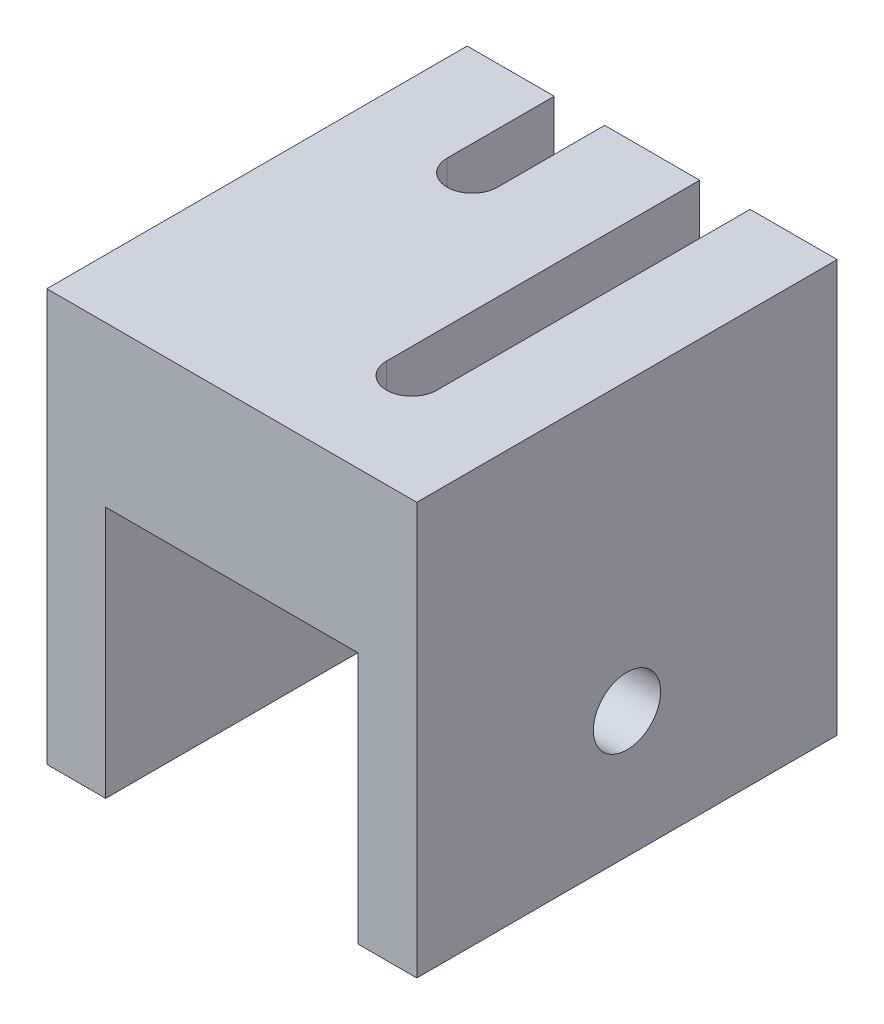
ISO-10303-21;
HEADER;
FILE_DESCRIPTION(('STEP AP214'),'2;1');
FILE_NAME('part.step','',(''),(''),'','','');
FILE_SCHEMA(('AUTOMOTIVE_DESIGN { 1 0 10303 214 1 1 1 1 }'));
ENDSEC;
DATA;
#1=APPLICATION_CONTEXT('core data for automotive mechanical design processes');
#2=APPLICATION_PROTOCOL_DEFINITION('international standard','automotive_design',2000,#1);
#3=PRODUCT_CONTEXT('',#1,'mechanical');
#4=PRODUCT('Part','Part','',(#3));
#5=PRODUCT_RELATED_PRODUCT_CATEGORY('part','',(#4));
#6=PRODUCT_DEFINITION_FORMATION('','',#4);
#7=PRODUCT_DEFINITION_CONTEXT('part definition',#1,'design');
#8=PRODUCT_DEFINITION('design','',#6,#7);
#9=PRODUCT_DEFINITION_SHAPE('','',#8);
#10=(LENGTH_UNIT() NAMED_UNIT(*) SI_UNIT(.MILLI.,.METRE.));
#11=(NAMED_UNIT(*) PLANE_ANGLE_UNIT() SI_UNIT($,.RADIAN.));
#12=(NAMED_UNIT(*) SI_UNIT($,.STERADIAN.) SOLID_ANGLE_UNIT());
#13=UNCERTAINTY_MEASURE_WITH_UNIT(LENGTH_MEASURE(1.E-05),#10,'distance_accuracy_value','');
#14=(GEOMETRIC_REPRESENTATION_CONTEXT(3) GLOBAL_UNCERTAINTY_ASSIGNED_CONTEXT((#13)) GLOBAL_UNIT_ASSIGNED_CONTEXT((#10,
#11,#12)) REPRESENTATION_CONTEXT('',''));
#15=CARTESIAN_POINT('',(0.,0.,0.));
#16=DIRECTION('',(0.,0.,1.));
#17=DIRECTION('',(1.,0.,0.));
#18=AXIS2_PLACEMENT_3D('',#15,#16,#17);
#19=CARTESIAN_POINT('',(0.,22.,50.));
#20=DIRECTION('',(0.,1.,0.));
#21=DIRECTION('',(0.,0.,1.));
#22=AXIS2_PLACEMENT_3D('',#19,#20,#21);
#23=PLANE('',#22);
#24=CARTESIAN_POINT('',(8.65024796436644,22.,37.2545179486985));
#25=DIRECTION('',(0.,1.,0.));
#26=DIRECTION('',(0.,0.,1.));
#27=AXIS2_PLACEMENT_3D('',#24,#25,#26);
#28=CIRCLE('',#27,5.);
#29=CARTESIAN_POINT('',(3.65024796436644,22.,37.2545179486985));
#30=VERTEX_POINT('',#29);
#31=CARTESIAN_POINT('',(13.6502479643664,22.,37.2545179486985));
#32=VERTEX_POINT('',#31);
#33=EDGE_CURVE('E210',#30,#32,#28,.T.);
#34=ORIENTED_EDGE('',*,*,#33,.T.);
#35=DIRECTION('',(0.,0.,-1.));
#36=VECTOR('',#35,1.);
#37=CARTESIAN_POINT('',(13.6502479643664,22.,0.));
#38=LINE('',#37,#36);
#39=CARTESIAN_POINT('',(13.6502479643664,22.,0.));
#40=VERTEX_POINT('',#39);
#41=EDGE_CURVE('E295',#32,#40,#38,.T.);
#42=ORIENTED_EDGE('',*,*,#41,.T.);
#43=DIRECTION('',(1.,0.,0.));
#44=VECTOR('',#43,1.);
#45=CARTESIAN_POINT('',(0.,22.,0.));
#46=LINE('',#45,#44);
#47=CARTESIAN_POINT('',(3.65024796436644,22.,0.));
#48=VERTEX_POINT('',#47);
#49=EDGE_CURVE('E362',#48,#40,#46,.T.);
#50=ORIENTED_EDGE('',*,*,#49,.F.);
#51=DIRECTION('',(0.,0.,-1.));
#52=VECTOR('',#51,1.);
#53=CARTESIAN_POINT('',(3.65024796436644,22.,0.));
#54=LINE('',#53,#52);
#55=EDGE_CURVE('E310',#30,#48,#54,.T.);
#56=ORIENTED_EDGE('',*,*,#55,.F.);
#57=EDGE_LOOP('',(#34,#42,#50,#56));
#58=FACE_BOUND('',#57,.T.);
#59=ADVANCED_FACE('F37',(#58),#23,.T.);
#60=CARTESIAN_POINT('',(0.,-15.,50.));
#61=DIRECTION('',(0.,1.,0.));
#62=DIRECTION('',(0.,0.,1.));
#63=AXIS2_PLACEMENT_3D('',#60,#61,#62);
#64=PLANE('',#63);
#65=DIRECTION('',(1.,0.,0.));
#66=VECTOR('',#65,1.);
#67=CARTESIAN_POINT('',(0.,-15.,0.));
#68=LINE('',#67,#66);
#69=CARTESIAN_POINT('',(15.,-15.,0.));
#70=VERTEX_POINT('',#69);
#71=CARTESIAN_POINT('',(22.,-15.,0.));
#72=VERTEX_POINT('',#71);
#73=EDGE_CURVE('E358',#70,#72,#68,.T.);
#74=ORIENTED_EDGE('',*,*,#73,.T.);
#75=DIRECTION('',(0.,0.,-1.));
#76=VECTOR('',#75,1.);
#77=CARTESIAN_POINT('',(22.,-15.,50.));
#78=LINE('',#77,#76);
#79=CARTESIAN_POINT('',(22.,-15.,50.));
#80=VERTEX_POINT('',#79);
#81=EDGE_CURVE('E366',#80,#72,#78,.T.);
#82=ORIENTED_EDGE('',*,*,#81,.F.);
#83=DIRECTION('',(1.,0.,0.));
#84=VECTOR('',#83,1.);
#85=CARTESIAN_POINT('',(0.,-15.,50.));
#86=LINE('',#85,#84);
#87=CARTESIAN_POINT('',(15.,-15.,50.));
#88=VERTEX_POINT('',#87);
#89=EDGE_CURVE('E346',#88,#80,#86,.T.);
#90=ORIENTED_EDGE('',*,*,#89,.F.);
#91=DIRECTION('',(0.,0.,-1.));
#92=VECTOR('',#91,1.);
#93=CARTESIAN_POINT('',(15.,-15.,50.));
#94=LINE('',#93,#92);
#95=EDGE_CURVE('E46',#88,#70,#94,.T.);
#96=ORIENTED_EDGE('',*,*,#95,.T.);
#97=EDGE_LOOP('',(#74,#82,#90,#96));
#98=FACE_BOUND('',#97,.T.);
#99=ADVANCED_FACE('F437',(#98),#64,.F.);
#100=CARTESIAN_POINT('',(22.,0.,50.));
#101=DIRECTION('',(-1.,0.,0.));
#102=DIRECTION('',(0.,0.,1.));
#103=AXIS2_PLACEMENT_3D('',#100,#101,#102);
#104=PLANE('',#103);
#105=CARTESIAN_POINT('',(22.,0.,25.));
#106=DIRECTION('',(-1.,0.,0.));
#107=DIRECTION('',(0.,0.,1.));
#108=AXIS2_PLACEMENT_3D('',#105,#106,#107);
#109=CIRCLE('',#108,4.);
#110=CARTESIAN_POINT('',(22.,0.,29.));
#111=VERTEX_POINT('',#110);
#112=EDGE_CURVE('E777',#111,#111,#109,.T.);
#113=ORIENTED_EDGE('',*,*,#112,.T.);
#114=EDGE_LOOP('',(#113));
#115=FACE_BOUND('',#114,.T.);
#116=DIRECTION('',(0.,1.,0.));
#117=VECTOR('',#116,1.);
#118=CARTESIAN_POINT('',(22.,0.,0.));
#119=LINE('',#118,#117);
#120=CARTESIAN_POINT('',(22.,34.,0.));
#121=VERTEX_POINT('',#120);
#122=EDGE_CURVE('E360',#72,#121,#119,.T.);
#123=ORIENTED_EDGE('',*,*,#122,.T.);
#124=DIRECTION('',(0.,0.,-1.));
#125=VECTOR('',#124,1.);
#126=CARTESIAN_POINT('',(22.,34.,0.));
#127=LINE('',#126,#125);
#128=CARTESIAN_POINT('',(22.,34.,50.));
#129=VERTEX_POINT('',#128);
#130=EDGE_CURVE('E242',#129,#121,#127,.T.);
#131=ORIENTED_EDGE('',*,*,#130,.F.);
#132=DIRECTION('',(0.,1.,0.));
#133=VECTOR('',#132,1.);
#134=CARTESIAN_POINT('',(22.,0.,50.));
#135=LINE('',#134,#133);
#136=EDGE_CURVE('E348',#80,#129,#135,.T.);
#137=ORIENTED_EDGE('',*,*,#136,.F.);
#138=ORIENTED_EDGE('',*,*,#81,.T.);
#139=EDGE_LOOP('',(#123,#131,#137,#138));
#140=FACE_BOUND('',#139,.T.);
#141=ADVANCED_FACE('F444',(#115,#140),#104,.F.);
#142=CARTESIAN_POINT('',(0.,0.,50.));
#143=DIRECTION('',(0.,0.,1.));
#144=DIRECTION('',(1.,0.,0.));
#145=AXIS2_PLACEMENT_3D('',#142,#143,#144);
#146=PLANE('',#145);
#147=DIRECTION('',(1.,0.,0.));
#148=VECTOR('',#147,1.);
#149=CARTESIAN_POINT('',(0.,15.,50.));
#150=LINE('',#149,#148);
#151=CARTESIAN_POINT('',(-15.,15.,50.));
#152=VERTEX_POINT('',#151);
#153=CARTESIAN_POINT('',(15.,15.,50.));
#154=VERTEX_POINT('',#153);
#155=EDGE_CURVE('E340',#152,#154,#150,.T.);
#156=ORIENTED_EDGE('',*,*,#155,.T.);
#157=DIRECTION('',(0.,1.,0.));
#158=VECTOR('',#157,1.);
#159=CARTESIAN_POINT('',(15.,0.,50.));
#160=LINE('',#159,#158);
#161=EDGE_CURVE('E342',#88,#154,#160,.T.);
#162=ORIENTED_EDGE('',*,*,#161,.F.);
#163=ORIENTED_EDGE('',*,*,#89,.T.);
#164=ORIENTED_EDGE('',*,*,#136,.T.);
#165=DIRECTION('',(1.,0.,0.));
#166=VECTOR('',#165,1.);
#167=CARTESIAN_POINT('',(0.,34.,50.));
#168=LINE('',#167,#166);
#169=CARTESIAN_POINT('',(-22.,34.,50.));
#170=VERTEX_POINT('',#169);
#171=EDGE_CURVE('E239',#170,#129,#168,.T.);
#172=ORIENTED_EDGE('',*,*,#171,.F.);
#173=DIRECTION('',(0.,1.,0.));
#174=VECTOR('',#173,1.);
#175=CARTESIAN_POINT('',(-22.,-15.,50.));
#176=LINE('',#175,#174);
#177=CARTESIAN_POINT('',(-22.,-15.,50.));
#178=VERTEX_POINT('',#177);
#179=EDGE_CURVE('E370',#178,#170,#176,.T.);
#180=ORIENTED_EDGE('',*,*,#179,.F.);
#181=DIRECTION('',(-1.,0.,0.));
#182=VECTOR('',#181,1.);
#183=CARTESIAN_POINT('',(-15.,-15.,50.));
#184=LINE('',#183,#182);
#185=CARTESIAN_POINT('',(-15.,-15.,50.));
#186=VERTEX_POINT('',#185);
#187=EDGE_CURVE('E372',#186,#178,#184,.T.);
#188=ORIENTED_EDGE('',*,*,#187,.F.);
#189=DIRECTION('',(0.,1.,0.));
#190=VECTOR('',#189,1.);
#191=CARTESIAN_POINT('',(-15.,-15.,50.));
#192=LINE('',#191,#190);
#193=EDGE_CURVE('E376',#186,#152,#192,.T.);
#194=ORIENTED_EDGE('',*,*,#193,.T.);
#195=EDGE_LOOP('',(#156,#162,#163,#164,#172,#180,#188,#194));
#196=FACE_BOUND('',#195,.T.);
#197=ADVANCED_FACE('F401',(#196),#146,.T.);
#198=CARTESIAN_POINT('',(15.,0.,50.));
#199=DIRECTION('',(-1.,0.,0.));
#200=DIRECTION('',(0.,0.,1.));
#201=AXIS2_PLACEMENT_3D('',#198,#199,#200);
#202=PLANE('',#201);
#203=CARTESIAN_POINT('',(15.,0.,25.));
#204=DIRECTION('',(-1.,0.,0.));
#205=DIRECTION('',(0.,0.,1.));
#206=AXIS2_PLACEMENT_3D('',#203,#204,#205);
#207=CIRCLE('',#206,4.);
#208=CARTESIAN_POINT('',(15.,0.,29.));
#209=VERTEX_POINT('',#208);
#210=EDGE_CURVE('E758',#209,#209,#207,.T.);
#211=ORIENTED_EDGE('',*,*,#210,.F.);
#212=EDGE_LOOP('',(#211));
#213=FACE_BOUND('',#212,.T.);
#214=DIRECTION('',(0.,1.,0.));
#215=VECTOR('',#214,1.);
#216=CARTESIAN_POINT('',(15.,0.,0.));
#217=LINE('',#216,#215);
#218=CARTESIAN_POINT('',(15.,15.,0.));
#219=VERTEX_POINT('',#218);
#220=EDGE_CURVE('E354',#70,#219,#217,.T.);
#221=ORIENTED_EDGE('',*,*,#220,.F.);
#222=ORIENTED_EDGE('',*,*,#95,.F.);
#223=ORIENTED_EDGE('',*,*,#161,.T.);
#224=DIRECTION('',(0.,0.,-1.));
#225=VECTOR('',#224,1.);
#226=CARTESIAN_POINT('',(15.,15.,50.));
#227=LINE('',#226,#225);
#228=EDGE_CURVE('E11',#154,#219,#227,.T.);
#229=ORIENTED_EDGE('',*,*,#228,.T.);
#230=EDGE_LOOP('',(#221,#222,#223,#229));
#231=FACE_BOUND('',#230,.T.);
#232=ADVANCED_FACE('F461',(#213,#231),#202,.T.);
#233=CARTESIAN_POINT('',(0.,0.,0.));
#234=DIRECTION('',(0.,0.,1.));
#235=DIRECTION('',(1.,0.,0.));
#236=AXIS2_PLACEMENT_3D('',#233,#234,#235);
#237=PLANE('',#236);
#238=DIRECTION('',(1.,0.,0.));
#239=VECTOR('',#238,1.);
#240=CARTESIAN_POINT('',(0.,15.,0.));
#241=LINE('',#240,#239);
#242=CARTESIAN_POINT('',(-15.,15.,0.));
#243=VERTEX_POINT('',#242);
#244=EDGE_CURVE('E351',#243,#219,#241,.T.);
#245=ORIENTED_EDGE('',*,*,#244,.F.);
#246=DIRECTION('',(0.,1.,0.));
#247=VECTOR('',#246,1.);
#248=CARTESIAN_POINT('',(-15.,-15.,0.));
#249=LINE('',#248,#247);
#250=CARTESIAN_POINT('',(-15.,-15.,0.));
#251=VERTEX_POINT('',#250);
#252=EDGE_CURVE('E373',#251,#243,#249,.T.);
#253=ORIENTED_EDGE('',*,*,#252,.F.);
#254=DIRECTION('',(-1.,0.,0.));
#255=VECTOR('',#254,1.);
#256=CARTESIAN_POINT('',(-15.,-15.,0.));
#257=LINE('',#256,#255);
#258=CARTESIAN_POINT('',(-22.,-15.,0.));
#259=VERTEX_POINT('',#258);
#260=EDGE_CURVE('E381',#251,#259,#257,.T.);
#261=ORIENTED_EDGE('',*,*,#260,.T.);
#262=DIRECTION('',(0.,1.,0.));
#263=VECTOR('',#262,1.);
#264=CARTESIAN_POINT('',(-22.,-15.,0.));
#265=LINE('',#264,#263);
#266=CARTESIAN_POINT('',(-22.,34.,0.));
#267=VERTEX_POINT('',#266);
#268=EDGE_CURVE('E339',#259,#267,#265,.T.);
#269=ORIENTED_EDGE('',*,*,#268,.T.);
#270=DIRECTION('',(-1.,0.,0.));
#271=VECTOR('',#270,1.);
#272=CARTESIAN_POINT('',(0.,34.,0.));
#273=LINE('',#272,#271);
#274=CARTESIAN_POINT('',(-11.6502479643664,34.,0.));
#275=VERTEX_POINT('',#274);
#276=EDGE_CURVE('E233',#275,#267,#273,.T.);
#277=ORIENTED_EDGE('',*,*,#276,.F.);
#278=DIRECTION('',(0.,-1.,0.));
#279=VECTOR('',#278,1.);
#280=CARTESIAN_POINT('',(-11.6502479643664,34.,0.));
#281=LINE('',#280,#279);
#282=CARTESIAN_POINT('',(-11.6502479643664,28.,0.));
#283=VERTEX_POINT('',#282);
#284=EDGE_CURVE('E285',#275,#283,#281,.T.);
#285=ORIENTED_EDGE('',*,*,#284,.T.);
#286=DIRECTION('',(-1.,0.,0.));
#287=VECTOR('',#286,1.);
#288=CARTESIAN_POINT('',(0.,28.,0.));
#289=LINE('',#288,#287);
#290=CARTESIAN_POINT('',(-13.6502479643664,28.,0.));
#291=VERTEX_POINT('',#290);
#292=EDGE_CURVE('E264',#283,#291,#289,.T.);
#293=ORIENTED_EDGE('',*,*,#292,.T.);
#294=DIRECTION('',(0.,-1.,0.));
#295=VECTOR('',#294,1.);
#296=CARTESIAN_POINT('',(-13.6502479643664,28.,0.));
#297=LINE('',#296,#295);
#298=CARTESIAN_POINT('',(-13.6502479643664,22.,0.));
#299=VERTEX_POINT('',#298);
#300=EDGE_CURVE('E323',#291,#299,#297,.T.);
#301=ORIENTED_EDGE('',*,*,#300,.T.);
#302=CARTESIAN_POINT('',(-3.65024796436643,22.,0.));
#303=VERTEX_POINT('',#302);
#304=EDGE_CURVE('E343',#299,#303,#46,.T.);
#305=ORIENTED_EDGE('',*,*,#304,.T.);
#306=DIRECTION('',(0.,-1.,0.));
#307=VECTOR('',#306,1.);
#308=CARTESIAN_POINT('',(-3.65024796436643,28.,0.));
#309=LINE('',#308,#307);
#310=CARTESIAN_POINT('',(-3.65024796436643,28.,0.));
#311=VERTEX_POINT('',#310);
#312=EDGE_CURVE('E330',#311,#303,#309,.T.);
#313=ORIENTED_EDGE('',*,*,#312,.F.);
#314=DIRECTION('',(1.,0.,0.));
#315=VECTOR('',#314,1.);
#316=CARTESIAN_POINT('',(0.,28.,0.));
#317=LINE('',#316,#315);
#318=CARTESIAN_POINT('',(-5.65024796436643,28.,0.));
#319=VERTEX_POINT('',#318);
#320=EDGE_CURVE('E205',#319,#311,#317,.T.);
#321=ORIENTED_EDGE('',*,*,#320,.F.);
#322=DIRECTION('',(0.,-1.,0.));
#323=VECTOR('',#322,1.);
#324=CARTESIAN_POINT('',(-5.65024796436643,34.,0.));
#325=LINE('',#324,#323);
#326=CARTESIAN_POINT('',(-5.65024796436643,34.,0.));
#327=VERTEX_POINT('',#326);
#328=EDGE_CURVE('E198',#327,#319,#325,.T.);
#329=ORIENTED_EDGE('',*,*,#328,.F.);
#330=DIRECTION('',(1.,0.,0.));
#331=VECTOR('',#330,1.);
#332=CARTESIAN_POINT('',(0.,34.,0.));
#333=LINE('',#332,#331);
#334=CARTESIAN_POINT('',(5.65024796436644,34.,0.));
#335=VERTEX_POINT('',#334);
#336=EDGE_CURVE('E203',#327,#335,#333,.T.);
#337=ORIENTED_EDGE('',*,*,#336,.T.);
#338=DIRECTION('',(0.,-1.,0.));
#339=VECTOR('',#338,1.);
#340=CARTESIAN_POINT('',(5.65024796436644,34.,0.));
#341=LINE('',#340,#339);
#342=CARTESIAN_POINT('',(5.65024796436644,28.,0.));
#343=VERTEX_POINT('',#342);
#344=EDGE_CURVE('E254',#335,#343,#341,.T.);
#345=ORIENTED_EDGE('',*,*,#344,.T.);
#346=CARTESIAN_POINT('',(3.65024796436644,28.,0.));
#347=VERTEX_POINT('',#346);
#348=EDGE_CURVE('E257',#347,#343,#317,.T.);
#349=ORIENTED_EDGE('',*,*,#348,.F.);
#350=DIRECTION('',(0.,-1.,0.));
#351=VECTOR('',#350,1.);
#352=CARTESIAN_POINT('',(3.65024796436644,28.,0.));
#353=LINE('',#352,#351);
#354=EDGE_CURVE('E333',#347,#48,#353,.T.);
#355=ORIENTED_EDGE('',*,*,#354,.T.);
#356=ORIENTED_EDGE('',*,*,#49,.T.);
#357=DIRECTION('',(0.,-1.,0.));
#358=VECTOR('',#357,1.);
#359=CARTESIAN_POINT('',(13.6502479643664,28.,0.));
#360=LINE('',#359,#358);
#361=CARTESIAN_POINT('',(13.6502479643664,28.,0.));
#362=VERTEX_POINT('',#361);
#363=EDGE_CURVE('E320',#362,#40,#360,.T.);
#364=ORIENTED_EDGE('',*,*,#363,.F.);
#365=DIRECTION('',(-1.,0.,0.));
#366=VECTOR('',#365,1.);
#367=CARTESIAN_POINT('',(0.,28.,0.));
#368=LINE('',#367,#366);
#369=CARTESIAN_POINT('',(11.6502479643664,28.,0.));
#370=VERTEX_POINT('',#369);
#371=EDGE_CURVE('E267',#362,#370,#368,.T.);
#372=ORIENTED_EDGE('',*,*,#371,.T.);
#373=DIRECTION('',(0.,-1.,0.));
#374=VECTOR('',#373,1.);
#375=CARTESIAN_POINT('',(11.6502479643664,34.,0.));
#376=LINE('',#375,#374);
#377=CARTESIAN_POINT('',(11.6502479643664,34.,0.));
#378=VERTEX_POINT('',#377);
#379=EDGE_CURVE('E282',#378,#370,#376,.T.);
#380=ORIENTED_EDGE('',*,*,#379,.F.);
#381=DIRECTION('',(-1.,0.,0.));
#382=VECTOR('',#381,1.);
#383=CARTESIAN_POINT('',(0.,34.,0.));
#384=LINE('',#383,#382);
#385=EDGE_CURVE('E245',#121,#378,#384,.T.);
#386=ORIENTED_EDGE('',*,*,#385,.F.);
#387=ORIENTED_EDGE('',*,*,#122,.F.);
#388=ORIENTED_EDGE('',*,*,#73,.F.);
#389=ORIENTED_EDGE('',*,*,#220,.T.);
#390=EDGE_LOOP('',(#245,#253,#261,#269,#277,#285,#293,#301,#305,#313,#321,#329,#337,#345,#349,
#355,#356,#364,#372,#380,#386,#387,#388,#389));
#391=FACE_BOUND('',#390,.T.);
#392=ADVANCED_FACE('F201',(#391),#237,.F.);
#393=CARTESIAN_POINT('',(0.,15.,50.));
#394=DIRECTION('',(0.,1.,0.));
#395=DIRECTION('',(0.,0.,1.));
#396=AXIS2_PLACEMENT_3D('',#393,#394,#395);
#397=PLANE('',#396);
#398=ORIENTED_EDGE('',*,*,#244,.T.);
#399=ORIENTED_EDGE('',*,*,#228,.F.);
#400=ORIENTED_EDGE('',*,*,#155,.F.);
#401=DIRECTION('',(0.,0.,-1.));
#402=VECTOR('',#401,1.);
#403=CARTESIAN_POINT('',(-15.,15.,50.));
#404=LINE('',#403,#402);
#405=EDGE_CURVE('E350',#152,#243,#404,.T.);
#406=ORIENTED_EDGE('',*,*,#405,.T.);
#407=EDGE_LOOP('',(#398,#399,#400,#406));
#408=FACE_BOUND('',#407,.T.);
#409=ADVANCED_FACE('F450',(#408),#397,.F.);
#410=DIRECTION('',(0.,0.,-1.));
#411=VECTOR('',#410,1.);
#412=CARTESIAN_POINT('',(-13.6502479643664,22.,0.));
#413=LINE('',#412,#411);
#414=CARTESIAN_POINT('',(-13.6502479643664,22.,12.7454820513015));
#415=VERTEX_POINT('',#414);
#416=EDGE_CURVE('E54',#415,#299,#413,.T.);
#417=ORIENTED_EDGE('',*,*,#416,.F.);
#418=CARTESIAN_POINT('',(-8.65024796436643,22.,12.7454820513015));
#419=DIRECTION('',(0.,1.,0.));
#420=DIRECTION('',(0.,0.,1.));
#421=AXIS2_PLACEMENT_3D('',#418,#419,#420);
#422=CIRCLE('',#421,5.);
#423=CARTESIAN_POINT('',(-3.65024796436643,22.,12.7454820513015));
#424=VERTEX_POINT('',#423);
#425=EDGE_CURVE('E59',#415,#424,#422,.T.);
#426=ORIENTED_EDGE('',*,*,#425,.T.);
#427=DIRECTION('',(0.,0.,-1.));
#428=VECTOR('',#427,1.);
#429=CARTESIAN_POINT('',(-3.65024796436643,22.,0.));
#430=LINE('',#429,#428);
#431=EDGE_CURVE('E313',#424,#303,#430,.T.);
#432=ORIENTED_EDGE('',*,*,#431,.T.);
#433=ORIENTED_EDGE('',*,*,#304,.F.);
#434=EDGE_LOOP('',(#417,#426,#432,#433));
#435=FACE_BOUND('',#434,.T.);
#436=ADVANCED_FACE('F440',(#435),#23,.T.);
#437=CARTESIAN_POINT('',(-22.,-15.,50.));
#438=DIRECTION('',(-1.,0.,0.));
#439=DIRECTION('',(0.,0.,1.));
#440=AXIS2_PLACEMENT_3D('',#437,#438,#439);
#441=PLANE('',#440);
#442=CARTESIAN_POINT('',(-22.,0.,25.));
#443=DIRECTION('',(-1.,0.,0.));
#444=DIRECTION('',(0.,0.,1.));
#445=AXIS2_PLACEMENT_3D('',#442,#443,#444);
#446=CIRCLE('',#445,4.);
#447=CARTESIAN_POINT('',(-22.,0.,29.));
#448=VERTEX_POINT('',#447);
#449=EDGE_CURVE('E787',#448,#448,#446,.T.);
#450=ORIENTED_EDGE('',*,*,#449,.F.);
#451=EDGE_LOOP('',(#450));
#452=FACE_BOUND('',#451,.T.);
#453=ORIENTED_EDGE('',*,*,#268,.F.);
#454=DIRECTION('',(0.,0.,-1.));
#455=VECTOR('',#454,1.);
#456=CARTESIAN_POINT('',(-22.,-15.,50.));
#457=LINE('',#456,#455);
#458=EDGE_CURVE('E355',#178,#259,#457,.T.);
#459=ORIENTED_EDGE('',*,*,#458,.F.);
#460=ORIENTED_EDGE('',*,*,#179,.T.);
#461=DIRECTION('',(0.,0.,1.));
#462=VECTOR('',#461,1.);
#463=CARTESIAN_POINT('',(-22.,34.,0.));
#464=LINE('',#463,#462);
#465=EDGE_CURVE('E236',#267,#170,#464,.T.);
#466=ORIENTED_EDGE('',*,*,#465,.F.);
#467=EDGE_LOOP('',(#453,#459,#460,#466));
#468=FACE_BOUND('',#467,.T.);
#469=ADVANCED_FACE('F39',(#452,#468),#441,.T.);
#470=CARTESIAN_POINT('',(-15.,-15.,50.));
#471=DIRECTION('',(0.,-1.,0.));
#472=DIRECTION('',(0.,0.,-1.));
#473=AXIS2_PLACEMENT_3D('',#470,#471,#472);
#474=PLANE('',#473);
#475=ORIENTED_EDGE('',*,*,#260,.F.);
#476=DIRECTION('',(0.,0.,-1.));
#477=VECTOR('',#476,1.);
#478=CARTESIAN_POINT('',(-15.,-15.,50.));
#479=LINE('',#478,#477);
#480=EDGE_CURVE('E379',#186,#251,#479,.T.);
#481=ORIENTED_EDGE('',*,*,#480,.F.);
#482=ORIENTED_EDGE('',*,*,#187,.T.);
#483=ORIENTED_EDGE('',*,*,#458,.T.);
#484=EDGE_LOOP('',(#475,#481,#482,#483));
#485=FACE_BOUND('',#484,.T.);
#486=ADVANCED_FACE('F389',(#485),#474,.T.);
#487=CARTESIAN_POINT('',(-15.,-15.,50.));
#488=DIRECTION('',(-1.,0.,0.));
#489=DIRECTION('',(0.,0.,1.));
#490=AXIS2_PLACEMENT_3D('',#487,#488,#489);
#491=PLANE('',#490);
#492=CARTESIAN_POINT('',(-15.,0.,25.));
#493=DIRECTION('',(-1.,0.,0.));
#494=DIRECTION('',(0.,0.,1.));
#495=AXIS2_PLACEMENT_3D('',#492,#493,#494);
#496=CIRCLE('',#495,4.);
#497=CARTESIAN_POINT('',(-15.,0.,29.));
#498=VERTEX_POINT('',#497);
#499=EDGE_CURVE('E41',#498,#498,#496,.T.);
#500=ORIENTED_EDGE('',*,*,#499,.T.);
#501=EDGE_LOOP('',(#500));
#502=FACE_BOUND('',#501,.T.);
#503=ORIENTED_EDGE('',*,*,#405,.F.);
#504=ORIENTED_EDGE('',*,*,#193,.F.);
#505=ORIENTED_EDGE('',*,*,#480,.T.);
#506=ORIENTED_EDGE('',*,*,#252,.T.);
#507=EDGE_LOOP('',(#503,#504,#505,#506));
#508=FACE_BOUND('',#507,.T.);
#509=ADVANCED_FACE('F397',(#502,#508),#491,.F.);
#510=CARTESIAN_POINT('',(8.65024796436644,28.,37.2545179486985));
#511=DIRECTION('',(0.,-1.,0.));
#512=DIRECTION('',(0.,0.,-1.));
#513=AXIS2_PLACEMENT_3D('',#510,#511,#512);
#514=CYLINDRICAL_SURFACE('',#513,5.);
#515=ORIENTED_EDGE('',*,*,#33,.F.);
#516=DIRECTION('',(0.,-1.,0.));
#517=VECTOR('',#516,1.);
#518=CARTESIAN_POINT('',(3.65024796436644,28.,37.2545179486985));
#519=LINE('',#518,#517);
#520=CARTESIAN_POINT('',(3.65024796436644,28.,37.2545179486985));
#521=VERTEX_POINT('',#520);
#522=EDGE_CURVE('E336',#521,#30,#519,.T.);
#523=ORIENTED_EDGE('',*,*,#522,.F.);
#524=CARTESIAN_POINT('',(8.65024796436644,28.,37.2545179486985));
#525=DIRECTION('',(0.,1.,0.));
#526=DIRECTION('',(0.,0.,1.));
#527=AXIS2_PLACEMENT_3D('',#524,#525,#526);
#528=CIRCLE('',#527,5.);
#529=CARTESIAN_POINT('',(13.6502479643664,28.,37.2545179486985));
#530=VERTEX_POINT('',#529);
#531=EDGE_CURVE('E291',#521,#530,#528,.T.);
#532=ORIENTED_EDGE('',*,*,#531,.T.);
#533=DIRECTION('',(0.,-1.,0.));
#534=VECTOR('',#533,1.);
#535=CARTESIAN_POINT('',(13.6502479643664,28.,37.2545179486985));
#536=LINE('',#535,#534);
#537=EDGE_CURVE('E308',#530,#32,#536,.T.);
#538=ORIENTED_EDGE('',*,*,#537,.T.);
#539=EDGE_LOOP('',(#515,#523,#532,#538));
#540=FACE_BOUND('',#539,.T.);
#541=ADVANCED_FACE('F465',(#540),#514,.F.);
#542=CARTESIAN_POINT('',(3.65024796436644,28.,0.));
#543=DIRECTION('',(-1.,0.,0.));
#544=DIRECTION('',(0.,0.,1.));
#545=AXIS2_PLACEMENT_3D('',#542,#543,#544);
#546=PLANE('',#545);
#547=ORIENTED_EDGE('',*,*,#55,.T.);
#548=ORIENTED_EDGE('',*,*,#354,.F.);
#549=DIRECTION('',(0.,0.,-1.));
#550=VECTOR('',#549,1.);
#551=CARTESIAN_POINT('',(3.65024796436644,28.,0.));
#552=LINE('',#551,#550);
#553=EDGE_CURVE('E294',#521,#347,#552,.T.);
#554=ORIENTED_EDGE('',*,*,#553,.F.);
#555=ORIENTED_EDGE('',*,*,#522,.T.);
#556=EDGE_LOOP('',(#547,#548,#554,#555));
#557=FACE_BOUND('',#556,.T.);
#558=ADVANCED_FACE('F483',(#557),#546,.F.);
#559=CARTESIAN_POINT('',(-3.65024796436643,28.,0.));
#560=DIRECTION('',(-1.,0.,0.));
#561=DIRECTION('',(0.,0.,1.));
#562=AXIS2_PLACEMENT_3D('',#559,#560,#561);
#563=PLANE('',#562);
#564=ORIENTED_EDGE('',*,*,#431,.F.);
#565=DIRECTION('',(0.,-1.,0.));
#566=VECTOR('',#565,1.);
#567=CARTESIAN_POINT('',(-3.65024796436643,28.,12.7454820513015));
#568=LINE('',#567,#566);
#569=CARTESIAN_POINT('',(-3.65024796436643,28.,12.7454820513015));
#570=VERTEX_POINT('',#569);
#571=EDGE_CURVE('E328',#570,#424,#568,.T.);
#572=ORIENTED_EDGE('',*,*,#571,.F.);
#573=DIRECTION('',(0.,0.,-1.));
#574=VECTOR('',#573,1.);
#575=CARTESIAN_POINT('',(-3.65024796436643,28.,0.));
#576=LINE('',#575,#574);
#577=EDGE_CURVE('E297',#570,#311,#576,.T.);
#578=ORIENTED_EDGE('',*,*,#577,.T.);
#579=ORIENTED_EDGE('',*,*,#312,.T.);
#580=EDGE_LOOP('',(#564,#572,#578,#579));
#581=FACE_BOUND('',#580,.T.);
#582=ADVANCED_FACE('F420',(#581),#563,.T.);
#583=CARTESIAN_POINT('',(-8.65024796436643,28.,12.7454820513015));
#584=DIRECTION('',(0.,-1.,0.));
#585=DIRECTION('',(0.,0.,-1.));
#586=AXIS2_PLACEMENT_3D('',#583,#584,#585);
#587=CYLINDRICAL_SURFACE('',#586,5.);
#588=ORIENTED_EDGE('',*,*,#425,.F.);
#589=DIRECTION('',(0.,-1.,0.));
#590=VECTOR('',#589,1.);
#591=CARTESIAN_POINT('',(-13.6502479643664,28.,12.7454820513015));
#592=LINE('',#591,#590);
#593=CARTESIAN_POINT('',(-13.6502479643664,28.,12.7454820513015));
#594=VERTEX_POINT('',#593);
#595=EDGE_CURVE('E326',#594,#415,#592,.T.);
#596=ORIENTED_EDGE('',*,*,#595,.F.);
#597=CARTESIAN_POINT('',(-8.65024796436643,28.,12.7454820513015));
#598=DIRECTION('',(0.,1.,0.));
#599=DIRECTION('',(0.,0.,1.));
#600=AXIS2_PLACEMENT_3D('',#597,#598,#599);
#601=CIRCLE('',#600,5.);
#602=EDGE_CURVE('E300',#594,#570,#601,.T.);
#603=ORIENTED_EDGE('',*,*,#602,.T.);
#604=ORIENTED_EDGE('',*,*,#571,.T.);
#605=EDGE_LOOP('',(#588,#596,#603,#604));
#606=FACE_BOUND('',#605,.T.);
#607=ADVANCED_FACE('F499',(#606),#587,.F.);
#608=CARTESIAN_POINT('',(-13.6502479643664,28.,0.));
#609=DIRECTION('',(-1.,0.,0.));
#610=DIRECTION('',(0.,0.,1.));
#611=AXIS2_PLACEMENT_3D('',#608,#609,#610);
#612=PLANE('',#611);
#613=ORIENTED_EDGE('',*,*,#416,.T.);
#614=ORIENTED_EDGE('',*,*,#300,.F.);
#615=DIRECTION('',(0.,0.,-1.));
#616=VECTOR('',#615,1.);
#617=CARTESIAN_POINT('',(-13.6502479643664,28.,0.));
#618=LINE('',#617,#616);
#619=EDGE_CURVE('E303',#594,#291,#618,.T.);
#620=ORIENTED_EDGE('',*,*,#619,.F.);
#621=ORIENTED_EDGE('',*,*,#595,.T.);
#622=EDGE_LOOP('',(#613,#614,#620,#621));
#623=FACE_BOUND('',#622,.T.);
#624=ADVANCED_FACE('F416',(#623),#612,.F.);
#625=CARTESIAN_POINT('',(13.6502479643664,28.,0.));
#626=DIRECTION('',(-1.,0.,0.));
#627=DIRECTION('',(0.,0.,1.));
#628=AXIS2_PLACEMENT_3D('',#625,#626,#627);
#629=PLANE('',#628);
#630=ORIENTED_EDGE('',*,*,#41,.F.);
#631=ORIENTED_EDGE('',*,*,#537,.F.);
#632=DIRECTION('',(0.,0.,-1.));
#633=VECTOR('',#632,1.);
#634=CARTESIAN_POINT('',(13.6502479643664,28.,0.));
#635=LINE('',#634,#633);
#636=EDGE_CURVE('E305',#530,#362,#635,.T.);
#637=ORIENTED_EDGE('',*,*,#636,.T.);
#638=ORIENTED_EDGE('',*,*,#363,.T.);
#639=EDGE_LOOP('',(#630,#631,#637,#638));
#640=FACE_BOUND('',#639,.T.);
#641=ADVANCED_FACE('F513',(#640),#629,.T.);
#642=CARTESIAN_POINT('',(0.,28.,0.));
#643=DIRECTION('',(0.,1.,0.));
#644=DIRECTION('',(0.,0.,1.));
#645=AXIS2_PLACEMENT_3D('',#642,#643,#644);
#646=PLANE('',#645);
#647=ORIENTED_EDGE('',*,*,#531,.F.);
#648=ORIENTED_EDGE('',*,*,#553,.T.);
#649=ORIENTED_EDGE('',*,*,#348,.T.);
#650=DIRECTION('',(0.,0.,-1.));
#651=VECTOR('',#650,1.);
#652=CARTESIAN_POINT('',(5.65024796436644,28.,0.));
#653=LINE('',#652,#651);
#654=CARTESIAN_POINT('',(5.65024796436644,28.,37.2545179486985));
#655=VERTEX_POINT('',#654);
#656=EDGE_CURVE('E223',#655,#343,#653,.T.);
#657=ORIENTED_EDGE('',*,*,#656,.F.);
#658=CARTESIAN_POINT('',(8.65024796436644,28.,37.2545179486985));
#659=DIRECTION('',(0.,1.,0.));
#660=DIRECTION('',(0.,0.,1.));
#661=AXIS2_PLACEMENT_3D('',#658,#659,#660);
#662=CIRCLE('',#661,3.);
#663=CARTESIAN_POINT('',(11.6502479643664,28.,37.2545179486985));
#664=VERTEX_POINT('',#663);
#665=EDGE_CURVE('E272',#655,#664,#662,.T.);
#666=ORIENTED_EDGE('',*,*,#665,.T.);
#667=DIRECTION('',(0.,0.,-1.));
#668=VECTOR('',#667,1.);
#669=CARTESIAN_POINT('',(11.6502479643664,28.,0.));
#670=LINE('',#669,#668);
#671=EDGE_CURVE('E269',#664,#370,#670,.T.);
#672=ORIENTED_EDGE('',*,*,#671,.T.);
#673=ORIENTED_EDGE('',*,*,#371,.F.);
#674=ORIENTED_EDGE('',*,*,#636,.F.);
#675=EDGE_LOOP('',(#647,#648,#649,#657,#666,#672,#673,#674));
#676=FACE_BOUND('',#675,.T.);
#677=ADVANCED_FACE('F520',(#676),#646,.F.);
#678=CARTESIAN_POINT('',(-5.65024796436643,34.,0.));
#679=DIRECTION('',(-1.,0.,0.));
#680=DIRECTION('',(0.,0.,1.));
#681=AXIS2_PLACEMENT_3D('',#678,#679,#680);
#682=PLANE('',#681);
#683=DIRECTION('',(0.,0.,-1.));
#684=VECTOR('',#683,1.);
#685=CARTESIAN_POINT('',(-5.65024796436643,28.,0.));
#686=LINE('',#685,#684);
#687=CARTESIAN_POINT('',(-5.65024796436643,28.,12.7454820513015));
#688=VERTEX_POINT('',#687);
#689=EDGE_CURVE('E256',#688,#319,#686,.T.);
#690=ORIENTED_EDGE('',*,*,#689,.F.);
#691=DIRECTION('',(0.,-1.,0.));
#692=VECTOR('',#691,1.);
#693=CARTESIAN_POINT('',(-5.65024796436643,34.,12.7454820513015));
#694=LINE('',#693,#692);
#695=CARTESIAN_POINT('',(-5.65024796436643,34.,12.7454820513015));
#696=VERTEX_POINT('',#695);
#697=EDGE_CURVE('E211',#696,#688,#694,.T.);
#698=ORIENTED_EDGE('',*,*,#697,.F.);
#699=DIRECTION('',(0.,0.,-1.));
#700=VECTOR('',#699,1.);
#701=CARTESIAN_POINT('',(-5.65024796436643,34.,0.));
#702=LINE('',#701,#700);
#703=EDGE_CURVE('E217',#696,#327,#702,.T.);
#704=ORIENTED_EDGE('',*,*,#703,.T.);
#705=ORIENTED_EDGE('',*,*,#328,.T.);
#706=EDGE_LOOP('',(#690,#698,#704,#705));
#707=FACE_BOUND('',#706,.T.);
#708=ADVANCED_FACE('F225',(#707),#682,.T.);
#709=CARTESIAN_POINT('',(-8.65024796436643,34.,12.7454820513015));
#710=DIRECTION('',(0.,-1.,0.));
#711=DIRECTION('',(0.,0.,-1.));
#712=AXIS2_PLACEMENT_3D('',#709,#710,#711);
#713=CYLINDRICAL_SURFACE('',#712,3.);
#714=CARTESIAN_POINT('',(-8.65024796436643,28.,12.7454820513015));
#715=DIRECTION('',(0.,1.,0.));
#716=DIRECTION('',(0.,0.,1.));
#717=AXIS2_PLACEMENT_3D('',#714,#715,#716);
#718=CIRCLE('',#717,3.);
#719=CARTESIAN_POINT('',(-11.6502479643664,28.,12.7454820513015));
#720=VERTEX_POINT('',#719);
#721=EDGE_CURVE('E259',#720,#688,#718,.T.);
#722=ORIENTED_EDGE('',*,*,#721,.F.);
#723=DIRECTION('',(0.,-1.,0.));
#724=VECTOR('',#723,1.);
#725=CARTESIAN_POINT('',(-11.6502479643664,34.,12.7454820513015));
#726=LINE('',#725,#724);
#727=CARTESIAN_POINT('',(-11.6502479643664,34.,12.7454820513015));
#728=VERTEX_POINT('',#727);
#729=EDGE_CURVE('E288',#728,#720,#726,.T.);
#730=ORIENTED_EDGE('',*,*,#729,.F.);
#731=CARTESIAN_POINT('',(-8.65024796436643,34.,12.7454820513015));
#732=DIRECTION('',(0.,1.,0.));
#733=DIRECTION('',(0.,0.,1.));
#734=AXIS2_PLACEMENT_3D('',#731,#732,#733);
#735=CIRCLE('',#734,3.);
#736=EDGE_CURVE('E226',#728,#696,#735,.T.);
#737=ORIENTED_EDGE('',*,*,#736,.T.);
#738=ORIENTED_EDGE('',*,*,#697,.T.);
#739=EDGE_LOOP('',(#722,#730,#737,#738));
#740=FACE_BOUND('',#739,.T.);
#741=ADVANCED_FACE('F423',(#740),#713,.F.);
#742=CARTESIAN_POINT('',(-11.6502479643664,34.,0.));
#743=DIRECTION('',(-1.,0.,0.));
#744=DIRECTION('',(0.,0.,1.));
#745=AXIS2_PLACEMENT_3D('',#742,#743,#744);
#746=PLANE('',#745);
#747=DIRECTION('',(0.,0.,-1.));
#748=VECTOR('',#747,1.);
#749=CARTESIAN_POINT('',(-11.6502479643664,28.,0.));
#750=LINE('',#749,#748);
#751=EDGE_CURVE('E262',#720,#283,#750,.T.);
#752=ORIENTED_EDGE('',*,*,#751,.T.);
#753=ORIENTED_EDGE('',*,*,#284,.F.);
#754=DIRECTION('',(0.,0.,-1.));
#755=VECTOR('',#754,1.);
#756=CARTESIAN_POINT('',(-11.6502479643664,34.,0.));
#757=LINE('',#756,#755);
#758=EDGE_CURVE('E228',#728,#275,#757,.T.);
#759=ORIENTED_EDGE('',*,*,#758,.F.);
#760=ORIENTED_EDGE('',*,*,#729,.T.);
#761=EDGE_LOOP('',(#752,#753,#759,#760));
#762=FACE_BOUND('',#761,.T.);
#763=ADVANCED_FACE('F424',(#762),#746,.F.);
#764=CARTESIAN_POINT('',(11.6502479643664,34.,0.));
#765=DIRECTION('',(-1.,0.,0.));
#766=DIRECTION('',(0.,0.,1.));
#767=AXIS2_PLACEMENT_3D('',#764,#765,#766);
#768=PLANE('',#767);
#769=ORIENTED_EDGE('',*,*,#671,.F.);
#770=DIRECTION('',(0.,-1.,0.));
#771=VECTOR('',#770,1.);
#772=CARTESIAN_POINT('',(11.6502479643664,34.,37.2545179486985));
#773=LINE('',#772,#771);
#774=CARTESIAN_POINT('',(11.6502479643664,34.,37.2545179486985));
#775=VERTEX_POINT('',#774);
#776=EDGE_CURVE('E280',#775,#664,#773,.T.);
#777=ORIENTED_EDGE('',*,*,#776,.F.);
#778=DIRECTION('',(0.,0.,-1.));
#779=VECTOR('',#778,1.);
#780=CARTESIAN_POINT('',(11.6502479643664,34.,0.));
#781=LINE('',#780,#779);
#782=EDGE_CURVE('E247',#775,#378,#781,.T.);
#783=ORIENTED_EDGE('',*,*,#782,.T.);
#784=ORIENTED_EDGE('',*,*,#379,.T.);
#785=EDGE_LOOP('',(#769,#777,#783,#784));
#786=FACE_BOUND('',#785,.T.);
#787=ADVANCED_FACE('F426',(#786),#768,.T.);
#788=CARTESIAN_POINT('',(8.65024796436644,34.,37.2545179486985));
#789=DIRECTION('',(0.,-1.,0.));
#790=DIRECTION('',(0.,0.,-1.));
#791=AXIS2_PLACEMENT_3D('',#788,#789,#790);
#792=CYLINDRICAL_SURFACE('',#791,3.);
#793=ORIENTED_EDGE('',*,*,#665,.F.);
#794=DIRECTION('',(0.,-1.,0.));
#795=VECTOR('',#794,1.);
#796=CARTESIAN_POINT('',(5.65024796436644,34.,37.2545179486985));
#797=LINE('',#796,#795);
#798=CARTESIAN_POINT('',(5.65024796436644,34.,37.2545179486985));
#799=VERTEX_POINT('',#798);
#800=EDGE_CURVE('E278',#799,#655,#797,.T.);
#801=ORIENTED_EDGE('',*,*,#800,.F.);
#802=CARTESIAN_POINT('',(8.65024796436644,34.,37.2545179486985));
#803=DIRECTION('',(0.,1.,0.));
#804=DIRECTION('',(0.,0.,1.));
#805=AXIS2_PLACEMENT_3D('',#802,#803,#804);
#806=CIRCLE('',#805,3.);
#807=EDGE_CURVE('E250',#799,#775,#806,.T.);
#808=ORIENTED_EDGE('',*,*,#807,.T.);
#809=ORIENTED_EDGE('',*,*,#776,.T.);
#810=EDGE_LOOP('',(#793,#801,#808,#809));
#811=FACE_BOUND('',#810,.T.);
#812=ADVANCED_FACE('F432',(#811),#792,.F.);
#813=CARTESIAN_POINT('',(5.65024796436644,34.,0.));
#814=DIRECTION('',(-1.,0.,0.));
#815=DIRECTION('',(0.,0.,1.));
#816=AXIS2_PLACEMENT_3D('',#813,#814,#815);
#817=PLANE('',#816);
#818=ORIENTED_EDGE('',*,*,#656,.T.);
#819=ORIENTED_EDGE('',*,*,#344,.F.);
#820=DIRECTION('',(0.,0.,-1.));
#821=VECTOR('',#820,1.);
#822=CARTESIAN_POINT('',(5.65024796436644,34.,0.));
#823=LINE('',#822,#821);
#824=EDGE_CURVE('E221',#799,#335,#823,.T.);
#825=ORIENTED_EDGE('',*,*,#824,.F.);
#826=ORIENTED_EDGE('',*,*,#800,.T.);
#827=EDGE_LOOP('',(#818,#819,#825,#826));
#828=FACE_BOUND('',#827,.T.);
#829=ADVANCED_FACE('F558',(#828),#817,.F.);
#830=CARTESIAN_POINT('',(0.,34.,0.));
#831=DIRECTION('',(0.,1.,0.));
#832=DIRECTION('',(0.,0.,1.));
#833=AXIS2_PLACEMENT_3D('',#830,#831,#832);
#834=PLANE('',#833);
#835=ORIENTED_EDGE('',*,*,#336,.F.);
#836=ORIENTED_EDGE('',*,*,#703,.F.);
#837=ORIENTED_EDGE('',*,*,#736,.F.);
#838=ORIENTED_EDGE('',*,*,#758,.T.);
#839=ORIENTED_EDGE('',*,*,#276,.T.);
#840=ORIENTED_EDGE('',*,*,#465,.T.);
#841=ORIENTED_EDGE('',*,*,#171,.T.);
#842=ORIENTED_EDGE('',*,*,#130,.T.);
#843=ORIENTED_EDGE('',*,*,#385,.T.);
#844=ORIENTED_EDGE('',*,*,#782,.F.);
#845=ORIENTED_EDGE('',*,*,#807,.F.);
#846=ORIENTED_EDGE('',*,*,#824,.T.);
#847=EDGE_LOOP('',(#835,#836,#837,#838,#839,#840,#841,#842,#843,#844,#845,#846));
#848=FACE_BOUND('',#847,.T.);
#849=ADVANCED_FACE('F215',(#848),#834,.T.);
#850=ORIENTED_EDGE('',*,*,#577,.F.);
#851=ORIENTED_EDGE('',*,*,#602,.F.);
#852=ORIENTED_EDGE('',*,*,#619,.T.);
#853=ORIENTED_EDGE('',*,*,#292,.F.);
#854=ORIENTED_EDGE('',*,*,#751,.F.);
#855=ORIENTED_EDGE('',*,*,#721,.T.);
#856=ORIENTED_EDGE('',*,*,#689,.T.);
#857=ORIENTED_EDGE('',*,*,#320,.T.);
#858=EDGE_LOOP('',(#850,#851,#852,#853,#854,#855,#856,#857));
#859=FACE_BOUND('',#858,.T.);
#860=ADVANCED_FACE('F411',(#859),#646,.F.);
#861=CARTESIAN_POINT('',(37.,0.,25.));
#862=DIRECTION('',(-1.,0.,0.));
#863=DIRECTION('',(0.,0.,1.));
#864=AXIS2_PLACEMENT_3D('',#861,#862,#863);
#865=CYLINDRICAL_SURFACE('',#864,4.);
#866=ORIENTED_EDGE('',*,*,#449,.T.);
#867=EDGE_LOOP('',(#866));
#868=FACE_BOUND('',#867,.T.);
#869=ORIENTED_EDGE('',*,*,#499,.F.);
#870=EDGE_LOOP('',(#869));
#871=FACE_BOUND('',#870,.T.);
#872=ADVANCED_FACE('F588',(#868,#871),#865,.F.);
#873=ORIENTED_EDGE('',*,*,#210,.T.);
#874=EDGE_LOOP('',(#873));
#875=FACE_BOUND('',#874,.T.);
#876=ORIENTED_EDGE('',*,*,#112,.F.);
#877=EDGE_LOOP('',(#876));
#878=FACE_BOUND('',#877,.T.);
#879=ADVANCED_FACE('F794',(#875,#878),#865,.F.);
#880=CLOSED_SHELL('',(#59,#99,#141,#197,#232,#392,#409,#436,#469,#486,#509,#541,#558,#582,#607,
#624,#641,#677,#708,#741,#763,#787,#812,#829,#849,#860,#872,#879));
#881=MANIFOLD_SOLID_BREP('B2',#880);
#882=ADVANCED_BREP_SHAPE_REPRESENTATION('',(#18,#881),#14);
#883=SHAPE_DEFINITION_REPRESENTATION(#9,#882);
ENDSEC;
END-ISO-10303-21;
